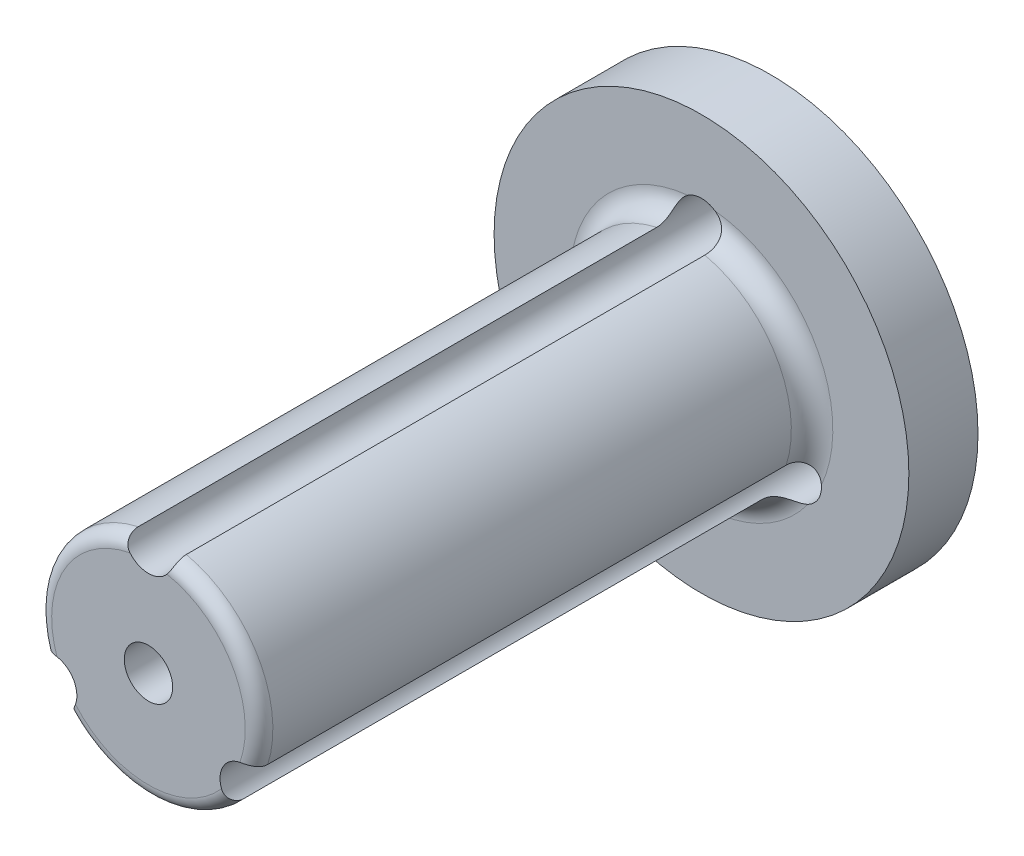
ISO-10303-21;
HEADER;
FILE_DESCRIPTION(('STEP AP214'),'2;1');
FILE_NAME('part.step','',(''),(''),'','','');
FILE_SCHEMA(('AUTOMOTIVE_DESIGN { 1 0 10303 214 1 1 1 1 }'));
ENDSEC;
DATA;
#1=APPLICATION_CONTEXT('core data for automotive mechanical design processes');
#2=APPLICATION_PROTOCOL_DEFINITION('international standard','automotive_design',2000,#1);
#3=PRODUCT_CONTEXT('',#1,'mechanical');
#4=PRODUCT('Part','Part','',(#3));
#5=PRODUCT_RELATED_PRODUCT_CATEGORY('part','',(#4));
#6=PRODUCT_DEFINITION_FORMATION('','',#4);
#7=PRODUCT_DEFINITION_CONTEXT('part definition',#1,'design');
#8=PRODUCT_DEFINITION('design','',#6,#7);
#9=PRODUCT_DEFINITION_SHAPE('','',#8);
#10=(LENGTH_UNIT() NAMED_UNIT(*) SI_UNIT(.MILLI.,.METRE.));
#11=(NAMED_UNIT(*) PLANE_ANGLE_UNIT() SI_UNIT($,.RADIAN.));
#12=(NAMED_UNIT(*) SI_UNIT($,.STERADIAN.) SOLID_ANGLE_UNIT());
#13=UNCERTAINTY_MEASURE_WITH_UNIT(LENGTH_MEASURE(1.E-05),#10,'distance_accuracy_value','');
#14=(GEOMETRIC_REPRESENTATION_CONTEXT(3) GLOBAL_UNCERTAINTY_ASSIGNED_CONTEXT((#13)) GLOBAL_UNIT_ASSIGNED_CONTEXT((#10,
#11,#12)) REPRESENTATION_CONTEXT('',''));
#15=CARTESIAN_POINT('',(0.,0.,0.));
#16=DIRECTION('',(0.,0.,1.));
#17=DIRECTION('',(1.,0.,0.));
#18=AXIS2_PLACEMENT_3D('',#15,#16,#17);
#19=CARTESIAN_POINT('',(0.,0.,45.));
#20=DIRECTION('',(0.,0.,-1.));
#21=DIRECTION('',(-1.,0.,0.));
#22=AXIS2_PLACEMENT_3D('',#19,#20,#21);
#23=CYLINDRICAL_SURFACE('',#22,8.);
#24=DIRECTION('',(0.,0.,-1.));
#25=VECTOR('',#24,1.);
#26=CARTESIAN_POINT('',(1.73950097656223,7.80859375,24.5));
#27=LINE('',#26,#25);
#28=CARTESIAN_POINT('',(1.73950097656223,7.80859375,6.5));
#29=VERTEX_POINT('',#28);
#30=CARTESIAN_POINT('',(1.73950097656223,7.80859375,44.));
#31=VERTEX_POINT('',#30);
#32=EDGE_CURVE('E147',#29,#31,#27,.F.);
#33=ORIENTED_EDGE('',*,*,#32,.T.);
#34=CARTESIAN_POINT('',(0.,0.,44.));
#35=DIRECTION('',(0.,0.,1.));
#36=DIRECTION('',(1.,0.,0.));
#37=AXIS2_PLACEMENT_3D('',#34,#35,#36);
#38=CIRCLE('',#37,8.);
#39=CARTESIAN_POINT('',(7.63219104361355,-2.39784483938914,44.));
#40=VERTEX_POINT('',#39);
#41=EDGE_CURVE('E296',#31,#40,#38,.F.);
#42=ORIENTED_EDGE('',*,*,#41,.T.);
#43=DIRECTION('',(0.,0.,-1.));
#44=VECTOR('',#43,1.);
#45=CARTESIAN_POINT('',(7.63219104361355,-2.39784483938914,24.5));
#46=LINE('',#45,#44);
#47=CARTESIAN_POINT('',(7.63219104361355,-2.39784483938914,6.5));
#48=VERTEX_POINT('',#47);
#49=EDGE_CURVE('E150',#40,#48,#46,.T.);
#50=ORIENTED_EDGE('',*,*,#49,.T.);
#51=CARTESIAN_POINT('',(0.,0.,6.5));
#52=DIRECTION('',(0.,0.,1.));
#53=DIRECTION('',(1.,0.,0.));
#54=AXIS2_PLACEMENT_3D('',#51,#52,#53);
#55=CIRCLE('',#54,8.);
#56=EDGE_CURVE('E135',#48,#29,#55,.T.);
#57=ORIENTED_EDGE('',*,*,#56,.T.);
#58=EDGE_LOOP('',(#33,#42,#50,#57));
#59=FACE_BOUND('',#58,.T.);
#60=ADVANCED_FACE('F39',(#59),#23,.T.);
#61=DIRECTION('',(0.,0.,-1.));
#62=VECTOR('',#61,1.);
#63=CARTESIAN_POINT('',(-7.6321910436137,-2.39784483938868,24.5));
#64=LINE('',#63,#62);
#65=CARTESIAN_POINT('',(-7.6321910436137,-2.39784483938868,6.5));
#66=VERTEX_POINT('',#65);
#67=CARTESIAN_POINT('',(-7.6321910436137,-2.39784483938868,44.));
#68=VERTEX_POINT('',#67);
#69=EDGE_CURVE('E356',#66,#68,#64,.F.);
#70=ORIENTED_EDGE('',*,*,#69,.T.);
#71=CARTESIAN_POINT('',(0.,0.,44.));
#72=DIRECTION('',(0.,0.,1.));
#73=DIRECTION('',(1.,0.,0.));
#74=AXIS2_PLACEMENT_3D('',#71,#72,#73);
#75=CIRCLE('',#74,8.);
#76=CARTESIAN_POINT('',(-1.73950097656223,7.80859375,44.));
#77=VERTEX_POINT('',#76);
#78=EDGE_CURVE('E11',#68,#77,#75,.F.);
#79=ORIENTED_EDGE('',*,*,#78,.T.);
#80=DIRECTION('',(0.,0.,-1.));
#81=VECTOR('',#80,1.);
#82=CARTESIAN_POINT('',(-1.73950097656223,7.80859375,24.5));
#83=LINE('',#82,#81);
#84=CARTESIAN_POINT('',(-1.73950097656223,7.80859375,6.5));
#85=VERTEX_POINT('',#84);
#86=EDGE_CURVE('E162',#77,#85,#83,.T.);
#87=ORIENTED_EDGE('',*,*,#86,.T.);
#88=CARTESIAN_POINT('',(0.,0.,6.5));
#89=DIRECTION('',(0.,0.,1.));
#90=DIRECTION('',(1.,0.,0.));
#91=AXIS2_PLACEMENT_3D('',#88,#89,#90);
#92=CIRCLE('',#91,8.);
#93=EDGE_CURVE('E143',#85,#66,#92,.T.);
#94=ORIENTED_EDGE('',*,*,#93,.T.);
#95=EDGE_LOOP('',(#70,#79,#87,#94));
#96=FACE_BOUND('',#95,.T.);
#97=ADVANCED_FACE('F366',(#96),#23,.T.);
#98=CARTESIAN_POINT('',(0.,0.,5.));
#99=DIRECTION('',(0.,0.,-1.));
#100=DIRECTION('',(-1.,0.,0.));
#101=AXIS2_PLACEMENT_3D('',#98,#99,#100);
#102=CYLINDRICAL_SURFACE('',#101,15.);
#103=CARTESIAN_POINT('',(0.,0.,5.));
#104=DIRECTION('',(0.,0.,1.));
#105=DIRECTION('',(1.,0.,0.));
#106=AXIS2_PLACEMENT_3D('',#103,#104,#105);
#107=CIRCLE('',#106,15.);
#108=CARTESIAN_POINT('',(15.,0.,5.));
#109=VERTEX_POINT('',#108);
#110=EDGE_CURVE('E172',#109,#109,#107,.T.);
#111=ORIENTED_EDGE('',*,*,#110,.F.);
#112=EDGE_LOOP('',(#111));
#113=FACE_BOUND('',#112,.T.);
#114=CARTESIAN_POINT('',(0.,0.,0.));
#115=DIRECTION('',(0.,0.,1.));
#116=DIRECTION('',(1.,0.,0.));
#117=AXIS2_PLACEMENT_3D('',#114,#115,#116);
#118=CIRCLE('',#117,15.);
#119=CARTESIAN_POINT('',(15.,0.,0.));
#120=VERTEX_POINT('',#119);
#121=EDGE_CURVE('E166',#120,#120,#118,.T.);
#122=ORIENTED_EDGE('',*,*,#121,.T.);
#123=EDGE_LOOP('',(#122));
#124=FACE_BOUND('',#123,.T.);
#125=ADVANCED_FACE('F225',(#113,#124),#102,.T.);
#126=CARTESIAN_POINT('',(0.,0.,5.));
#127=DIRECTION('',(0.,0.,1.));
#128=DIRECTION('',(1.,0.,0.));
#129=AXIS2_PLACEMENT_3D('',#126,#127,#128);
#130=PLANE('',#129);
#131=CARTESIAN_POINT('',(0.,8.,5.));
#132=DIRECTION('',(0.,0.,1.));
#133=DIRECTION('',(1.,0.,0.));
#134=AXIS2_PLACEMENT_3D('',#131,#132,#133);
#135=CIRCLE('',#134,1.75);
#136=CARTESIAN_POINT('',(0.980951076582536,9.44921875,5.));
#137=VERTEX_POINT('',#136);
#138=CARTESIAN_POINT('',(-0.980951076582536,9.44921875,5.));
#139=VERTEX_POINT('',#138);
#140=EDGE_CURVE('E161',#137,#139,#135,.T.);
#141=ORIENTED_EDGE('',*,*,#140,.F.);
#142=CARTESIAN_POINT('',(0.,0.,5.));
#143=DIRECTION('',(0.,0.,1.));
#144=DIRECTION('',(1.,0.,0.));
#145=AXIS2_PLACEMENT_3D('',#142,#143,#144);
#146=CIRCLE('',#145,9.5);
#147=CARTESIAN_POINT('',(8.67373902170759,-3.87508082280963,5.));
#148=VERTEX_POINT('',#147);
#149=EDGE_CURVE('E136',#137,#148,#146,.F.);
#150=ORIENTED_EDGE('',*,*,#149,.T.);
#151=CARTESIAN_POINT('',(6.92820323027517,-4.0000000000002,5.));
#152=DIRECTION('',(0.,0.,1.));
#153=DIRECTION('',(1.,0.,0.));
#154=AXIS2_PLACEMENT_3D('',#151,#152,#153);
#155=CIRCLE('',#154,1.75000000000045);
#156=CARTESIAN_POINT('',(7.69278794512437,-5.574137927191,5.));
#157=VERTEX_POINT('',#156);
#158=EDGE_CURVE('E378',#157,#148,#155,.T.);
#159=ORIENTED_EDGE('',*,*,#158,.F.);
#160=CARTESIAN_POINT('',(0.,0.,5.));
#161=DIRECTION('',(0.,0.,1.));
#162=DIRECTION('',(1.,0.,0.));
#163=AXIS2_PLACEMENT_3D('',#160,#161,#162);
#164=CIRCLE('',#163,9.5);
#165=CARTESIAN_POINT('',(-7.69278794512463,-5.57413792719064,5.));
#166=VERTEX_POINT('',#165);
#167=EDGE_CURVE('E194',#157,#166,#164,.F.);
#168=ORIENTED_EDGE('',*,*,#167,.T.);
#169=CARTESIAN_POINT('',(-6.92820323027585,-3.9999999999998,5.));
#170=DIRECTION('',(0.,0.,1.));
#171=DIRECTION('',(1.,0.,0.));
#172=AXIS2_PLACEMENT_3D('',#169,#170,#171);
#173=CIRCLE('',#172,1.7500000000003);
#174=CARTESIAN_POINT('',(-8.67373902170807,-3.87508082280856,5.));
#175=VERTEX_POINT('',#174);
#176=EDGE_CURVE('E189',#175,#166,#173,.T.);
#177=ORIENTED_EDGE('',*,*,#176,.F.);
#178=CARTESIAN_POINT('',(0.,0.,5.));
#179=DIRECTION('',(0.,0.,1.));
#180=DIRECTION('',(1.,0.,0.));
#181=AXIS2_PLACEMENT_3D('',#178,#179,#180);
#182=CIRCLE('',#181,9.5);
#183=EDGE_CURVE('E153',#175,#139,#182,.F.);
#184=ORIENTED_EDGE('',*,*,#183,.T.);
#185=EDGE_LOOP('',(#141,#150,#159,#168,#177,#184));
#186=FACE_BOUND('',#185,.T.);
#187=ORIENTED_EDGE('',*,*,#110,.T.);
#188=EDGE_LOOP('',(#187));
#189=FACE_BOUND('',#188,.T.);
#190=ADVANCED_FACE('F360',(#186,#189),#130,.T.);
#191=CARTESIAN_POINT('',(0.,0.,0.));
#192=DIRECTION('',(0.,0.,1.));
#193=DIRECTION('',(1.,0.,0.));
#194=AXIS2_PLACEMENT_3D('',#191,#192,#193);
#195=PLANE('',#194);
#196=CARTESIAN_POINT('',(0.,8.,0.));
#197=DIRECTION('',(0.,0.,-1.));
#198=DIRECTION('',(-1.,0.,0.));
#199=AXIS2_PLACEMENT_3D('',#196,#197,#198);
#200=CIRCLE('',#199,1.75);
#201=CARTESIAN_POINT('',(-1.75,8.,0.));
#202=VERTEX_POINT('',#201);
#203=EDGE_CURVE('E384',#202,#202,#200,.T.);
#204=ORIENTED_EDGE('',*,*,#203,.F.);
#205=EDGE_LOOP('',(#204));
#206=FACE_BOUND('',#205,.T.);
#207=CARTESIAN_POINT('',(0.,0.,0.));
#208=DIRECTION('',(0.,0.,-1.));
#209=DIRECTION('',(-1.,0.,0.));
#210=AXIS2_PLACEMENT_3D('',#207,#208,#209);
#211=CIRCLE('',#210,1.75);
#212=CARTESIAN_POINT('',(-1.75,0.,0.));
#213=VERTEX_POINT('',#212);
#214=EDGE_CURVE('E401',#213,#213,#211,.T.);
#215=ORIENTED_EDGE('',*,*,#214,.F.);
#216=EDGE_LOOP('',(#215));
#217=FACE_BOUND('',#216,.T.);
#218=CARTESIAN_POINT('',(-6.92820323027585,-3.9999999999998,0.));
#219=DIRECTION('',(0.,0.,-1.));
#220=DIRECTION('',(-1.,0.,0.));
#221=AXIS2_PLACEMENT_3D('',#218,#219,#220);
#222=CIRCLE('',#221,1.7500000000003);
#223=CARTESIAN_POINT('',(-8.67820323027615,-3.9999999999998,0.));
#224=VERTEX_POINT('',#223);
#225=EDGE_CURVE('E397',#224,#224,#222,.T.);
#226=ORIENTED_EDGE('',*,*,#225,.F.);
#227=EDGE_LOOP('',(#226));
#228=FACE_BOUND('',#227,.T.);
#229=CARTESIAN_POINT('',(6.92820323027517,-4.0000000000002,0.));
#230=DIRECTION('',(0.,0.,-1.));
#231=DIRECTION('',(-1.,0.,0.));
#232=AXIS2_PLACEMENT_3D('',#229,#230,#231);
#233=CIRCLE('',#232,1.75000000000045);
#234=CARTESIAN_POINT('',(5.17820323027472,-4.0000000000002,0.));
#235=VERTEX_POINT('',#234);
#236=EDGE_CURVE('E393',#235,#235,#233,.T.);
#237=ORIENTED_EDGE('',*,*,#236,.F.);
#238=EDGE_LOOP('',(#237));
#239=FACE_BOUND('',#238,.T.);
#240=ORIENTED_EDGE('',*,*,#121,.F.);
#241=EDGE_LOOP('',(#240));
#242=FACE_BOUND('',#241,.T.);
#243=ADVANCED_FACE('F409',(#206,#217,#228,#239,#242),#195,.F.);
#244=DIRECTION('',(0.,0.,-1.));
#245=VECTOR('',#244,1.);
#246=CARTESIAN_POINT('',(5.89269006705073,-5.41074891061133,24.5));
#247=LINE('',#246,#245);
#248=CARTESIAN_POINT('',(5.89269006705073,-5.41074891061133,6.5));
#249=VERTEX_POINT('',#248);
#250=CARTESIAN_POINT('',(5.89269006705073,-5.41074891061133,44.));
#251=VERTEX_POINT('',#250);
#252=EDGE_CURVE('E374',#249,#251,#247,.F.);
#253=ORIENTED_EDGE('',*,*,#252,.T.);
#254=CARTESIAN_POINT('',(0.,0.,44.));
#255=DIRECTION('',(0.,0.,1.));
#256=DIRECTION('',(1.,0.,0.));
#257=AXIS2_PLACEMENT_3D('',#254,#255,#256);
#258=CIRCLE('',#257,8.);
#259=CARTESIAN_POINT('',(-5.89269006705132,-5.41074891061069,44.));
#260=VERTEX_POINT('',#259);
#261=EDGE_CURVE('E64',#251,#260,#258,.F.);
#262=ORIENTED_EDGE('',*,*,#261,.T.);
#263=DIRECTION('',(0.,0.,-1.));
#264=VECTOR('',#263,1.);
#265=CARTESIAN_POINT('',(-5.89269006705132,-5.41074891061069,24.5));
#266=LINE('',#265,#264);
#267=CARTESIAN_POINT('',(-5.89269006705132,-5.41074891061069,6.5));
#268=VERTEX_POINT('',#267);
#269=EDGE_CURVE('E372',#260,#268,#266,.T.);
#270=ORIENTED_EDGE('',*,*,#269,.T.);
#271=CARTESIAN_POINT('',(0.,0.,6.5));
#272=DIRECTION('',(0.,0.,1.));
#273=DIRECTION('',(1.,0.,0.));
#274=AXIS2_PLACEMENT_3D('',#271,#272,#273);
#275=CIRCLE('',#274,8.);
#276=EDGE_CURVE('E199',#268,#249,#275,.T.);
#277=ORIENTED_EDGE('',*,*,#276,.T.);
#278=EDGE_LOOP('',(#253,#262,#270,#277));
#279=FACE_BOUND('',#278,.T.);
#280=ADVANCED_FACE('F375',(#279),#23,.T.);
#281=CARTESIAN_POINT('',(0.,0.,45.));
#282=DIRECTION('',(0.,0.,1.));
#283=DIRECTION('',(1.,0.,0.));
#284=AXIS2_PLACEMENT_3D('',#281,#282,#283);
#285=PLANE('',#284);
#286=CARTESIAN_POINT('',(6.92820323027517,-4.0000000000002,45.));
#287=DIRECTION('',(0.,0.,1.));
#288=DIRECTION('',(1.,0.,0.));
#289=AXIS2_PLACEMENT_3D('',#286,#287,#288);
#290=CIRCLE('',#289,1.75000000000045);
#291=CARTESIAN_POINT('',(6.61913553949347,-2.27750844341234,45.));
#292=VERTEX_POINT('',#291);
#293=CARTESIAN_POINT('',(5.28194793907498,-4.59358530658804,45.));
#294=VERTEX_POINT('',#293);
#295=EDGE_CURVE('E176',#292,#294,#290,.T.);
#296=ORIENTED_EDGE('',*,*,#295,.F.);
#297=CARTESIAN_POINT('',(0.,0.,45.));
#298=DIRECTION('',(0.,0.,1.));
#299=DIRECTION('',(1.,0.,0.));
#300=AXIS2_PLACEMENT_3D('',#297,#298,#299);
#301=CIRCLE('',#300,7.);
#302=CARTESIAN_POINT('',(1.33718760041773,6.87109375,45.));
#303=VERTEX_POINT('',#302);
#304=EDGE_CURVE('E316',#292,#303,#301,.T.);
#305=ORIENTED_EDGE('',*,*,#304,.T.);
#306=CARTESIAN_POINT('',(0.,8.,45.));
#307=DIRECTION('',(0.,0.,1.));
#308=DIRECTION('',(1.,0.,0.));
#309=AXIS2_PLACEMENT_3D('',#306,#307,#308);
#310=CIRCLE('',#309,1.75);
#311=CARTESIAN_POINT('',(-1.33718760041773,6.87109375,45.));
#312=VERTEX_POINT('',#311);
#313=EDGE_CURVE('E154',#312,#303,#310,.T.);
#314=ORIENTED_EDGE('',*,*,#313,.F.);
#315=CARTESIAN_POINT('',(0.,0.,45.));
#316=DIRECTION('',(0.,0.,1.));
#317=DIRECTION('',(1.,0.,0.));
#318=AXIS2_PLACEMENT_3D('',#315,#316,#317);
#319=CIRCLE('',#318,7.);
#320=CARTESIAN_POINT('',(-6.61913553949351,-2.27750844341222,45.));
#321=VERTEX_POINT('',#320);
#322=EDGE_CURVE('E326',#312,#321,#319,.T.);
#323=ORIENTED_EDGE('',*,*,#322,.T.);
#324=CARTESIAN_POINT('',(-6.92820323027585,-3.9999999999998,45.));
#325=DIRECTION('',(0.,0.,1.));
#326=DIRECTION('',(1.,0.,0.));
#327=AXIS2_PLACEMENT_3D('',#324,#325,#326);
#328=CIRCLE('',#327,1.7500000000003);
#329=CARTESIAN_POINT('',(-5.28194793907568,-4.59358530658724,45.));
#330=VERTEX_POINT('',#329);
#331=EDGE_CURVE('E183',#330,#321,#328,.T.);
#332=ORIENTED_EDGE('',*,*,#331,.F.);
#333=CARTESIAN_POINT('',(0.,0.,45.));
#334=DIRECTION('',(0.,0.,1.));
#335=DIRECTION('',(1.,0.,0.));
#336=AXIS2_PLACEMENT_3D('',#333,#334,#335);
#337=CIRCLE('',#336,7.);
#338=EDGE_CURVE('E319',#330,#294,#337,.T.);
#339=ORIENTED_EDGE('',*,*,#338,.T.);
#340=EDGE_LOOP('',(#296,#305,#314,#323,#332,#339));
#341=FACE_BOUND('',#340,.T.);
#342=CARTESIAN_POINT('',(0.,0.,45.));
#343=DIRECTION('',(0.,0.,1.));
#344=DIRECTION('',(1.,0.,0.));
#345=AXIS2_PLACEMENT_3D('',#342,#343,#344);
#346=CIRCLE('',#345,1.75);
#347=CARTESIAN_POINT('',(1.75,0.,45.));
#348=VERTEX_POINT('',#347);
#349=EDGE_CURVE('E168',#348,#348,#346,.T.);
#350=ORIENTED_EDGE('',*,*,#349,.F.);
#351=EDGE_LOOP('',(#350));
#352=FACE_BOUND('',#351,.T.);
#353=ADVANCED_FACE('F313',(#341,#352),#285,.T.);
#354=CARTESIAN_POINT('',(6.92820323027517,-4.0000000000002,49.));
#355=DIRECTION('',(0.,0.,-1.));
#356=DIRECTION('',(-1.,0.,0.));
#357=AXIS2_PLACEMENT_3D('',#354,#355,#356);
#358=CYLINDRICAL_SURFACE('',#357,1.75000000000045);
#359=ORIENTED_EDGE('',*,*,#49,.F.);
#360=CARTESIAN_POINT('',(7.63219104361355,-2.39784483938914,44.));
#361=CARTESIAN_POINT('',(7.63218978688258,-2.39784860910094,44.02811120597));
#362=CARTESIAN_POINT('',(7.63109873859668,-2.39736440838002,44.0562087207067));
#363=CARTESIAN_POINT('',(7.62673902320567,-2.39545765616746,44.1121993899972));
#364=CARTESIAN_POINT('',(7.6234705774965,-2.39403520007696,44.1400925650366));
#365=CARTESIAN_POINT('',(7.61041750358698,-2.38842343876988,44.2231086173015));
#366=CARTESIAN_POINT('',(7.59738510645363,-2.38288947693107,44.2776708800824));
#367=CARTESIAN_POINT('',(7.56282698607486,-2.36902018084552,44.3836470441095));
#368=CARTESIAN_POINT('',(7.54129847169464,-2.36068392612621,44.4350599042989));
#369=CARTESIAN_POINT('',(7.49002906625985,-2.34241442823895,44.533332707532));
#370=CARTESIAN_POINT('',(7.46028669202147,-2.33248089678481,44.5801918262348));
#371=CARTESIAN_POINT('',(7.39315258989592,-2.31253392010939,44.6678660326608));
#372=CARTESIAN_POINT('',(7.35578091207197,-2.302520749152,44.7086964888744));
#373=CARTESIAN_POINT('',(7.27416473557805,-2.28402980191697,44.7831624008763));
#374=CARTESIAN_POINT('',(7.229927398189,-2.27555044551536,44.8168052678108));
#375=CARTESIAN_POINT('',(7.13832102513075,-2.26207690210707,44.8743338061451));
#376=CARTESIAN_POINT('',(7.09123968926836,-2.25692266301807,44.8986400858434));
#377=CARTESIAN_POINT('',(6.99349194759196,-2.25053276153458,44.9394086169296));
#378=CARTESIAN_POINT('',(6.9428228141078,-2.24930011400131,44.955864825042));
#379=CARTESIAN_POINT('',(6.84650964319938,-2.25133586739713,44.9792827583578));
#380=CARTESIAN_POINT('',(6.80108004075557,-2.25403417317542,44.9872078524021));
#381=CARTESIAN_POINT('',(6.71001736273103,-2.26304154711235,44.9975828022077));
#382=CARTESIAN_POINT('',(6.66438470731343,-2.26934505806379,45.0000410563316));
#383=CARTESIAN_POINT('',(6.61913553949347,-2.27750844341234,45.));
#384=B_SPLINE_CURVE_WITH_KNOTS('',3,(#360,#361,#362,#363,#364,#365,#366,#367,#368,#369,#370,
#371,#372,#373,#374,#375,#376,#377,#378,#379,#380,#381,#382,#383),.UNSPECIFIED.,.F.,.F.,(4,2,2,
2,2,2,2,2,2,2,2,4),(0.,0.0842812335076775,0.168553898677798,0.33679461114836,0.50509063993801,
0.673417077979861,0.841306715286471,1.00902239652084,1.16790377859235,1.32690727682666,
1.4650199907131,1.60292038372158),.UNSPECIFIED.);
#385=EDGE_CURVE('E295',#40,#292,#384,.T.);
#386=ORIENTED_EDGE('',*,*,#385,.T.);
#387=ORIENTED_EDGE('',*,*,#295,.T.);
#388=CARTESIAN_POINT('',(5.28194793907498,-4.59358530658804,45.));
#389=CARTESIAN_POINT('',(5.29089511913655,-4.61840465135959,45.0000004961663));
#390=CARTESIAN_POINT('',(5.30040576957352,-4.64301510322305,44.9992027444303));
#391=CARTESIAN_POINT('',(5.3204876571239,-4.69169662891554,44.9958896995651));
#392=CARTESIAN_POINT('',(5.33105950027535,-4.71576738481951,44.9933734201845));
#393=CARTESIAN_POINT('',(5.36423157481409,-4.78690392049663,44.9830722290595));
#394=CARTESIAN_POINT('',(5.38830408770301,-4.83293739573089,44.9725353802326));
#395=CARTESIAN_POINT('',(5.43928898421718,-4.92099804442384,44.9435871570175));
#396=CARTESIAN_POINT('',(5.46621147492046,-4.96300988008116,44.9251469987402));
#397=CARTESIAN_POINT('',(5.52123151874431,-5.04174662024218,44.8805194929087));
#398=CARTESIAN_POINT('',(5.54932771993859,-5.07847740217209,44.8543408584813));
#399=CARTESIAN_POINT('',(5.60378308384687,-5.14462755483881,44.7961397873217));
#400=CARTESIAN_POINT('',(5.63016503528472,-5.17429311919149,44.7644164893853));
#401=CARTESIAN_POINT('',(5.68098486326521,-5.22813670058207,44.695241699529));
#402=CARTESIAN_POINT('',(5.70542137703587,-5.25231089252479,44.6577862450033));
#403=CARTESIAN_POINT('',(5.75208847505147,-5.29627646387308,44.5762141234298));
#404=CARTESIAN_POINT('',(5.77416078488218,-5.31580754088716,44.5318666902773));
#405=CARTESIAN_POINT('',(5.81342297204321,-5.34923346065272,44.4390884568644));
#406=CARTESIAN_POINT('',(5.83061210916474,-5.36312744905064,44.3906570389804));
#407=CARTESIAN_POINT('',(5.86038863604105,-5.38660379711883,44.2863215222657));
#408=CARTESIAN_POINT('',(5.87241510959286,-5.39567890709282,44.2301384377709));
#409=CARTESIAN_POINT('',(5.88453248139883,-5.40473255195166,44.1445660892495));
#410=CARTESIAN_POINT('',(5.88758464266177,-5.40699055665717,44.1157895564909));
#411=CARTESIAN_POINT('',(5.8916648330923,-5.40999699454454,44.0580139877802));
#412=CARTESIAN_POINT('',(5.89269279143663,-5.41074537490737,44.0290149440783));
#413=CARTESIAN_POINT('',(5.89269006705073,-5.41074891061133,44.));
#414=B_SPLINE_CURVE_WITH_KNOTS('',3,(#388,#389,#390,#391,#392,#393,#394,#395,#396,#397,#398,
#399,#400,#401,#402,#403,#404,#405,#406,#407,#408,#409,#410,#411,#412,#413),.UNSPECIFIED.,.F.,
.F.,(4,2,2,2,2,2,2,2,2,2,2,2,4),(0.,0.0791144673625341,0.158274376187263,0.316457259470695,
0.475221207490775,0.633807071969064,0.785584501620673,0.937467332048787,1.09650939957048,
1.25557556241005,1.4291129174139,1.51609543639021,1.6030809986757),.UNSPECIFIED.);
#415=EDGE_CURVE('E288',#294,#251,#414,.T.);
#416=ORIENTED_EDGE('',*,*,#415,.T.);
#417=ORIENTED_EDGE('',*,*,#252,.F.);
#418=CARTESIAN_POINT('',(5.89269006705073,-5.41074891061133,6.5));
#419=CARTESIAN_POINT('',(5.89269406280909,-5.41073872165121,6.45871284850004));
#420=CARTESIAN_POINT('',(5.89407273416536,-5.41176346569479,6.41742706896812));
#421=CARTESIAN_POINT('',(5.89960727120262,-5.41580785517767,6.33513844263905));
#422=CARTESIAN_POINT('',(5.90376326635917,-5.41882759362118,6.29413560912255));
#423=CARTESIAN_POINT('',(5.91488914100291,-5.42679332486031,6.21263219274662));
#424=CARTESIAN_POINT('',(5.92186348609199,-5.43174237415716,6.17213251258417));
#425=CARTESIAN_POINT('',(5.93867060940302,-5.44340866584259,6.09200298710328));
#426=CARTESIAN_POINT('',(5.94850330868447,-5.45012585939902,6.05237311779537));
#427=CARTESIAN_POINT('',(5.98241772182104,-5.47266470959441,5.93511089383794));
#428=CARTESIAN_POINT('',(6.0109115012075,-5.49087023915009,5.85913827244902));
#429=CARTESIAN_POINT('',(6.08008806622173,-5.53127114237435,5.71422798138761));
#430=CARTESIAN_POINT('',(6.12075749995087,-5.55346213494831,5.64528271592281));
#431=CARTESIAN_POINT('',(6.2127395375977,-5.59784728223869,5.51888848300046));
#432=CARTESIAN_POINT('',(6.26361847307154,-5.62001282186054,5.46111605986805));
#433=CARTESIAN_POINT('',(6.37603311935911,-5.66167997584347,5.35591180621979));
#434=CARTESIAN_POINT('',(6.43756141752733,-5.68118342641228,5.30847283448616));
#435=CARTESIAN_POINT('',(6.56322830600965,-5.7126283778671,5.2286863896568));
#436=CARTESIAN_POINT('',(6.62661390165095,-5.72509822784466,5.19535566743866));
#437=CARTESIAN_POINT('',(6.758299900172,-5.74299846549415,5.13782746340369));
#438=CARTESIAN_POINT('',(6.82659938098415,-5.74843017022356,5.11362827339199));
#439=CARTESIAN_POINT('',(6.9646909707572,-5.75096416303512,5.07370387637624));
#440=CARTESIAN_POINT('',(7.03444854960472,-5.74818258972398,5.05786421291157));
#441=CARTESIAN_POINT('',(7.17433162425723,-5.73403405883886,5.03273498147848));
#442=CARTESIAN_POINT('',(7.24445748014904,-5.72265595943836,5.02345394428318));
#443=CARTESIAN_POINT('',(7.37915933021638,-5.6922240836797,5.0102945297637));
#444=CARTESIAN_POINT('',(7.44382050199776,-5.67365657245154,5.00613267448008));
#445=CARTESIAN_POINT('',(7.57049625773741,-5.62925783378371,5.00100126157638));
#446=CARTESIAN_POINT('',(7.63251896700503,-5.60345109777534,5.0000210780495));
#447=CARTESIAN_POINT('',(7.69278794512437,-5.574137927191,5.));
#448=B_SPLINE_CURVE_WITH_KNOTS('',3,(#418,#419,#420,#421,#422,#423,#424,#425,#426,#427,#428,
#429,#430,#431,#432,#433,#434,#435,#436,#437,#438,#439,#440,#441,#442,#443,#444,#445,#446,#447),
.UNSPECIFIED.,.F.,.F.,(4,2,2,2,2,2,2,2,2,2,2,2,2,2,4),(0.,0.123823108477727,0.247651989844821,
0.371677849001791,0.495700283203983,0.743842322911542,0.991713239076821,1.23070088009871,
1.46952283438764,1.6865094138047,1.90345538236726,2.11734841699476,2.33151915170971,
2.53320134750509,2.73420928357523),.UNSPECIFIED.);
#449=EDGE_CURVE('E236',#249,#157,#448,.T.);
#450=ORIENTED_EDGE('',*,*,#449,.T.);
#451=ORIENTED_EDGE('',*,*,#158,.T.);
#452=CARTESIAN_POINT('',(8.67373902170759,-3.87508082280963,5.));
#453=CARTESIAN_POINT('',(8.67066745475763,-3.83216462649147,5.00000460118286));
#454=CARTESIAN_POINT('',(8.6660131993461,-3.78937602657043,5.00041264318316));
#455=CARTESIAN_POINT('',(8.65356989692251,-3.70425691861459,5.00235319080033));
#456=CARTESIAN_POINT('',(8.64577888965105,-3.66192671406471,5.00388640006511));
#457=CARTESIAN_POINT('',(8.61765744703327,-3.53556866092694,5.01067393459036));
#458=CARTESIAN_POINT('',(8.59261137111808,-3.45262879479402,5.01812286684352));
#459=CARTESIAN_POINT('',(8.53089188078188,-3.29195145857721,5.04169499201923));
#460=CARTESIAN_POINT('',(8.49415849927965,-3.21424338086956,5.05786322745449));
#461=CARTESIAN_POINT('',(8.41152473088846,-3.06764385790046,5.10154947745827));
#462=CARTESIAN_POINT('',(8.36566073601073,-2.9987191385238,5.12902288245918));
#463=CARTESIAN_POINT('',(8.27425771241209,-2.87945537370145,5.1930589335426));
#464=CARTESIAN_POINT('',(8.22931117717743,-2.82788468684597,5.22817805815457));
#465=CARTESIAN_POINT('',(8.13860093499069,-2.73442391230208,5.30882180884733));
#466=CARTESIAN_POINT('',(8.09283677639628,-2.69253936512923,5.35435236084648));
#467=CARTESIAN_POINT('',(8.00749756958114,-2.62142164077417,5.45101134481344));
#468=CARTESIAN_POINT('',(7.96771803626752,-2.59145754599534,5.5014283386316));
#469=CARTESIAN_POINT('',(7.89282077426588,-2.53914294784747,5.60917456449888));
#470=CARTESIAN_POINT('',(7.85770347494267,-2.51679314541433,5.66650443225726));
#471=CARTESIAN_POINT('',(7.79206069986681,-2.47756655187818,5.79024138332588));
#472=CARTESIAN_POINT('',(7.76193091115128,-2.46109281253527,5.8569851201802));
#473=CARTESIAN_POINT('',(7.71046389696005,-2.43430066443614,5.99495233991614));
#474=CARTESIAN_POINT('',(7.68912896213687,-2.42398385896348,6.06617698430634));
#475=CARTESIAN_POINT('',(7.65929755020242,-2.40996349946639,6.19781909587382));
#476=CARTESIAN_POINT('',(7.64914863467918,-2.40538533468684,6.25777428605908));
#477=CARTESIAN_POINT('',(7.63898398494283,-2.40084305506794,6.34831699992603));
#478=CARTESIAN_POINT('',(7.63643890101087,-2.39971643772364,6.37858234194651));
#479=CARTESIAN_POINT('',(7.63304182799066,-2.39821842996114,6.43922963190219));
#480=CARTESIAN_POINT('',(7.63219001094544,-2.39784711628487,6.46961159137202));
#481=CARTESIAN_POINT('',(7.63219104361355,-2.39784483938914,6.5));
#482=B_SPLINE_CURVE_WITH_KNOTS('',3,(#452,#453,#454,#455,#456,#457,#458,#459,#460,#461,#462,
#463,#464,#465,#466,#467,#468,#469,#470,#471,#472,#473,#474,#475,#476,#477,#478,#479,#480,#481),
.UNSPECIFIED.,.F.,.F.,(4,2,2,2,2,2,2,2,2,2,2,2,2,2,4),(0.,0.129014407687284,0.258109566178222,
0.517654340188707,0.778552906671908,1.03843170646094,1.26783778274699,1.49737475755277,
1.70904771234159,1.92074014748386,2.14498358125942,2.36928538322904,2.55174832229299,
2.64287719859624,2.7340153335023),.UNSPECIFIED.);
#483=EDGE_CURVE('E142',#148,#48,#482,.T.);
#484=ORIENTED_EDGE('',*,*,#483,.T.);
#485=EDGE_LOOP('',(#359,#386,#387,#416,#417,#450,#451,#484));
#486=FACE_BOUND('',#485,.T.);
#487=ORIENTED_EDGE('',*,*,#236,.T.);
#488=EDGE_LOOP('',(#487));
#489=FACE_BOUND('',#488,.T.);
#490=ADVANCED_FACE('F261',(#486,#489),#358,.F.);
#491=CARTESIAN_POINT('',(-6.92820323027585,-3.9999999999998,49.));
#492=DIRECTION('',(0.,0.,-1.));
#493=DIRECTION('',(-1.,0.,0.));
#494=AXIS2_PLACEMENT_3D('',#491,#492,#493);
#495=CYLINDRICAL_SURFACE('',#494,1.7500000000003);
#496=ORIENTED_EDGE('',*,*,#269,.F.);
#497=CARTESIAN_POINT('',(-5.89269006705132,-5.41074891061069,44.));
#498=CARTESIAN_POINT('',(-5.89269270335201,-5.41074593739384,44.02811120597));
#499=CARTESIAN_POINT('',(-5.89172784908422,-5.41004316222195,44.0562087207067));
#500=CARTESIAN_POINT('',(-5.88789669553391,-5.40722091404635,44.1121993899972));
#501=CARTESIAN_POINT('',(-5.8850305895692,-5.40510158507657,44.1400925650366));
#502=CARTESIAN_POINT('',(-5.87364412476253,-5.39660317212699,44.2231086173015));
#503=CARTESIAN_POINT('',(-5.86233537465987,-5.3880837660567,44.2776708800824));
#504=CARTESIAN_POINT('',(-5.8330451517278,-5.36509020394442,44.3836470441095));
#505=CARTESIAN_POINT('',(-5.81506148617836,-5.35061409094506,44.4350599042989));
#506=CARTESIAN_POINT('',(-5.77360493417621,-5.31534823234522,44.533332707532));
#507=CARTESIAN_POINT('',(-5.75013105646845,-5.29455734641299,44.5801918262348));
#508=CARTESIAN_POINT('',(-5.69928941687607,-5.2463909968497,44.6678660326609));
#509=CARTESIAN_POINT('',(-5.67193191754257,-5.2190327599508,44.7086964888744));
#510=CARTESIAN_POINT('',(-5.61511019925005,-5.15759655136482,44.7831624008763));
#511=CARTESIAN_POINT('',(-5.585648192504,-5.12352557159092,44.8168052678108));
#512=CARTESIAN_POINT('',(-5.52817657510432,-5.05092889707806,44.8743338061451));
#513=CARTESIAN_POINT('',(-5.50017220518488,-5.01273238372161,44.8986400858434));
#514=CARTESIAN_POINT('',(-5.44576451733432,-4.93127530700902,44.9394086169296));
#515=CARTESIAN_POINT('',(-5.41936244651453,-4.88801087399063,44.955864825042));
#516=CARTESIAN_POINT('',(-5.37296887521695,-4.80358334456698,44.9792827583578));
#517=CARTESIAN_POINT('',(-5.35259087534623,-4.76289100187765,44.9872078524021));
#518=CARTESIAN_POINT('',(-5.31486015098474,-4.67952472240325,44.9975828022077));
#519=CARTESIAN_POINT('',(-5.29750282389292,-4.63685392809373,45.0000410563316));
#520=CARTESIAN_POINT('',(-5.28194793907568,-4.59358530658724,45.));
#521=B_SPLINE_CURVE_WITH_KNOTS('',3,(#497,#498,#499,#500,#501,#502,#503,#504,#505,#506,#507,
#508,#509,#510,#511,#512,#513,#514,#515,#516,#517,#518,#519,#520),.UNSPECIFIED.,.F.,.F.,(4,2,2,
2,2,2,2,2,2,2,2,4),(0.,0.0842812335076776,0.168553898677798,0.336794611148359,0.505090639938015,
0.67341707797987,0.841306715286474,1.00902239652084,1.16790377859234,1.32690727682664,
1.46501999071312,1.60292038372165),.UNSPECIFIED.);
#522=EDGE_CURVE('E49',#260,#330,#521,.T.);
#523=ORIENTED_EDGE('',*,*,#522,.T.);
#524=ORIENTED_EDGE('',*,*,#331,.T.);
#525=CARTESIAN_POINT('',(-6.61913553949351,-2.27750844341222,45.));
#526=CARTESIAN_POINT('',(-6.64510331260174,-2.27284725625198,45.0000004961663));
#527=CARTESIAN_POINT('',(-6.6711719143326,-2.26877849520518,44.9992027444303));
#528=CARTESIAN_POINT('',(-6.72337229605247,-2.26182915713349,44.9958896995652));
#529=CARTESIAN_POINT('',(-6.74950410372934,-2.25894926391547,44.9933734201845));
#530=CARTESIAN_POINT('',(-6.82769618803232,-2.25210885532367,44.9830722290595));
#531=CARTESIAN_POINT('',(-6.87959860345413,-2.24993952540126,44.9725353802326));
#532=CARTESIAN_POINT('',(-6.98135381055306,-2.25006341664534,44.9435871570175));
#533=CARTESIAN_POINT('',(-7.03119837284356,-2.25237305969886,44.9251469987402));
#534=CARTESIAN_POINT('',(-7.12689641194611,-2.26065344528712,44.8805194929087));
#535=CARTESIAN_POINT('',(-7.17275430279543,-2.26662007830624,44.8543408584813));
#536=CARTESIAN_POINT('',(-7.25726969742318,-2.28070473048976,44.7961397873217));
#537=CARTESIAN_POINT('',(-7.29615180548914,-2.28871938846,44.7644164893853));
#538=CARTESIAN_POINT('',(-7.36819162879436,-2.30580885981175,44.695241699529));
#539=CARTESIAN_POINT('',(-7.40134535001806,-2.31488440554571,44.6577862450033));
#540=CARTESIAN_POINT('',(-7.46275420070537,-2.33331651227395,44.5762141234298));
#541=CARTESIAN_POINT('',(-7.49070476447819,-2.3426661548005,44.5318666902773));
#542=CARTESIAN_POINT('',(-7.53928355372054,-2.3599552464073,44.4390884568644));
#543=CARTESIAN_POINT('',(-7.55991066919379,-2.36789448162471,44.3906570389804));
#544=CARTESIAN_POINT('',(-7.59513004644709,-2.38194353630196,44.2863215222657));
#545=CARTESIAN_POINT('',(-7.60900255900261,-2.38782121292878,44.2301384377709));
#546=CARTESIAN_POINT('',(-7.62290193135019,-2.39378834231042,44.1445660892495));
#547=CARTESIAN_POINT('',(-7.6263835014185,-2.39530258914783,44.1157895564909));
#548=CARTESIAN_POINT('',(-7.63102724821913,-2.39733291876926,44.0580139877802));
#549=CARTESIAN_POINT('',(-7.6321893437972,-2.39784896662806,44.0290149440783));
#550=CARTESIAN_POINT('',(-7.63219104361369,-2.39784483938868,44.));
#551=B_SPLINE_CURVE_WITH_KNOTS('',3,(#525,#526,#527,#528,#529,#530,#531,#532,#533,#534,#535,
#536,#537,#538,#539,#540,#541,#542,#543,#544,#545,#546,#547,#548,#549,#550),.UNSPECIFIED.,.F.,
.F.,(4,2,2,2,2,2,2,2,2,2,2,2,4),(0.,0.0791144673625411,0.158274376187278,0.316457259470729,
0.475221207490825,0.633807071969128,0.785584501620742,0.937467332048861,1.09650939957054,
1.2555755624101,1.42911291741396,1.51609543639027,1.60308099867577),.UNSPECIFIED.);
#552=EDGE_CURVE('E56',#321,#68,#551,.T.);
#553=ORIENTED_EDGE('',*,*,#552,.T.);
#554=ORIENTED_EDGE('',*,*,#69,.F.);
#555=CARTESIAN_POINT('',(-7.63219104361369,-2.39784483938868,6.5));
#556=CARTESIAN_POINT('',(-7.63218421759457,-2.39785339429699,6.45871284850004));
#557=CARTESIAN_POINT('',(-7.63376100764682,-2.3985349866932,6.41742706896812));
#558=CARTESIAN_POINT('',(-7.64003082020043,-2.40130584162421,6.33513844263905));
#559=CARTESIAN_POINT('',(-7.64472398798357,-2.40339516978604,6.29413560912254));
#560=CARTESIAN_POINT('',(-7.65718545091825,-2.40904759424726,6.21263219274661));
#561=CARTESIAN_POINT('',(-7.66495862587844,-2.41261302962074,6.17213251258415));
#562=CARTESIAN_POINT('',(-7.68346549250149,-2.42133527952991,6.09200298710326));
#563=CARTESIAN_POINT('',(-7.69419910240423,-2.42649205011721,6.05237311779536));
#564=CARTESIAN_POINT('',(-7.73067552581382,-2.44459336835022,5.93511089383792));
#565=CARTESIAN_POINT('',(-7.76068886659162,-2.46016694037088,5.859138272449));
#566=CARTESIAN_POINT('',(-7.83026535762679,-2.4998751514076,5.71422798138758));
#567=CARTESIAN_POINT('',(-7.86981803779561,-2.52400041788758,5.64528271592278));
#568=CARTESIAN_POINT('',(-7.95424772172322,-2.58146662553638,5.51888848300043));
#569=CARTESIAN_POINT('',(-7.99888310986127,-2.61444630636331,5.46111605986801));
#570=CARTESIAN_POINT('',(-8.09117524685768,-2.69096666881431,5.35591180621974));
#571=CARTESIAN_POINT('',(-8.13882987959584,-2.73450001279519,5.30847283448612));
#572=CARTESIAN_POINT('',(-8.22889545061767,-2.82760825490801,5.22868638965675));
#573=CARTESIAN_POINT('',(-8.27138745530027,-2.8762668659786,5.19535566743862));
#574=CARTESIAN_POINT('',(-8.35273251509905,-2.98136016719579,5.13782746340365));
#575=CARTESIAN_POINT('',(-8.39158624978666,-3.03779340027968,5.11362827339195));
#576=CARTESIAN_POINT('',(-8.46282654682101,-3.15611722866633,5.07370387637621));
#577=CARTESIAN_POINT('',(-8.49529642309484,-3.21791985071034,5.05786421291154));
#578=CARTESIAN_POINT('',(-8.55298497324837,-3.34613641236143,5.03273498147845));
#579=CARTESIAN_POINT('',(-8.57819417806667,-3.41255623472611,5.02345394428316));
#580=CARTESIAN_POINT('',(-8.61919032560852,-3.54442739670046,5.01029452976369));
#581=CARTESIAN_POINT('',(-8.63544097509057,-3.60970936971563,5.00613267448008));
#582=CARTESIAN_POINT('',(-8.66032841737807,-3.74161316156355,5.00100126157638));
#583=CARTESIAN_POINT('',(-8.66899048303989,-3.80822977140498,5.0000210780495));
#584=CARTESIAN_POINT('',(-8.67373902170807,-3.87508082280856,5.));
#585=B_SPLINE_CURVE_WITH_KNOTS('',3,(#555,#556,#557,#558,#559,#560,#561,#562,#563,#564,#565,
#566,#567,#568,#569,#570,#571,#572,#573,#574,#575,#576,#577,#578,#579,#580,#581,#582,#583,#584),
.UNSPECIFIED.,.F.,.F.,(4,2,2,2,2,2,2,2,2,2,2,2,2,2,4),(0.,0.123823108477731,0.247651989844831,
0.371677849001805,0.495700283204001,0.743842322911569,0.991713239076857,1.23070088009875,
1.4695228343877,1.68650941380476,1.90345538236731,2.1173484169948,2.33151915170973,
2.53320134750495,2.73420928357491),.UNSPECIFIED.);
#586=EDGE_CURVE('E251',#66,#175,#585,.T.);
#587=ORIENTED_EDGE('',*,*,#586,.T.);
#588=ORIENTED_EDGE('',*,*,#176,.T.);
#589=CARTESIAN_POINT('',(-7.69278794512463,-5.57413792719065,5.));
#590=CARTESIAN_POINT('',(-7.65408564540432,-5.59293597034161,5.00000460118286));
#591=CARTESIAN_POINT('',(-7.61470250317456,-5.61029956688003,5.00041264318316));
#592=CARTESIAN_POINT('',(-7.53476554212555,-5.64208290485211,5.00235319080033));
#593=CARTESIAN_POINT('',(-7.49421100600224,-5.6565007969089,5.00388640006511));
#594=CARTESIAN_POINT('',(-7.37072100070331,-5.69532593977967,5.01067393459036));
#595=CARTESIAN_POINT('',(-7.28636993168814,-5.71510533483843,5.01812286684352));
#596=CARTESIAN_POINT('',(-7.11635953154389,-5.74199335640701,5.04169499201925));
#597=CARTESIAN_POINT('',(-7.03069567141872,-5.74903535371297,5.0578632274545));
#598=CARTESIAN_POINT('',(-6.86241987614924,-5.75077217256027,5.10154947745829));
#599=CARTESIAN_POINT('',(-6.77979732078149,-5.74551514756543,5.12902288245921));
#600=CARTESIAN_POINT('',(-6.63081035889508,-5.72598968955744,5.19305893354262));
#601=CARTESIAN_POINT('',(-6.56367556637031,-5.71285019165986,5.22817805815459));
#602=CARTESIAN_POINT('',(-6.4373810402646,-5.68102320481463,5.30882180884735));
#603=CARTESIAN_POINT('',(-6.37822587908971,-5.66233255447547,5.35435236084649));
#604=CARTESIAN_POINT('',(-6.27396651973135,-5.62398549561225,5.45101134481345));
#605=CARTESIAN_POINT('',(-6.22812708579467,-5.60451745660138,5.50142833863161));
#606=CARTESIAN_POINT('',(-6.14537268380904,-5.56581182410798,5.60917456449889));
#607=CARTESIAN_POINT('',(-6.10845853747078,-5.54657425199835,5.66650443225727));
#608=CARTESIAN_POINT('',(-6.04166592342663,-5.5093392379758,5.79024138332589));
#609=CARTESIAN_POINT('',(-6.01233435230258,-5.49148294520895,5.85698512018021));
#610=CARTESIAN_POINT('',(-5.96339816433117,-5.46030727751197,5.99495233991615));
#611=CARTESIAN_POINT('',(-5.94379608129436,-5.44698908470333,6.06617698430636));
#612=CARTESIAN_POINT('',(-5.91673838783248,-5.42816450388588,6.19781909587384));
#613=CARTESIAN_POINT('',(-5.90769912306906,-5.42166436761166,6.25777428605909));
#614=CARTESIAN_POINT('',(-5.89868306865983,-5.41513266252886,6.34831699992604));
#615=CARTESIAN_POINT('',(-5.89643484745334,-5.41349186386117,6.37858234194652));
#616=CARTESIAN_POINT('',(-5.89343899816584,-5.41129891620841,6.4392296319022));
#617=CARTESIAN_POINT('',(-5.89269152256681,-5.41074687784601,6.46961159137202));
#618=CARTESIAN_POINT('',(-5.89269006705132,-5.41074891061068,6.5));
#619=B_SPLINE_CURVE_WITH_KNOTS('',3,(#589,#590,#591,#592,#593,#594,#595,#596,#597,#598,#599,
#600,#601,#602,#603,#604,#605,#606,#607,#608,#609,#610,#611,#612,#613,#614,#615,#616,#617,#618),
.UNSPECIFIED.,.F.,.F.,(4,2,2,2,2,2,2,2,2,2,2,2,2,2,4),(0.,0.129014407687258,0.258109566178168,
0.5176543401886,0.778552906671744,1.03843170646072,1.26783778274674,1.49737475755248,
1.70904771234128,1.92074014748355,2.14498358125911,2.36928538322874,2.55174832229268,
2.64287719859592,2.73401533350198),.UNSPECIFIED.);
#620=EDGE_CURVE('E242',#166,#268,#619,.T.);
#621=ORIENTED_EDGE('',*,*,#620,.T.);
#622=EDGE_LOOP('',(#496,#523,#524,#553,#554,#587,#588,#621));
#623=FACE_BOUND('',#622,.T.);
#624=ORIENTED_EDGE('',*,*,#225,.T.);
#625=EDGE_LOOP('',(#624));
#626=FACE_BOUND('',#625,.T.);
#627=ADVANCED_FACE('F257',(#623,#626),#495,.F.);
#628=CARTESIAN_POINT('',(0.,0.,49.));
#629=DIRECTION('',(0.,0.,-1.));
#630=DIRECTION('',(-1.,0.,0.));
#631=AXIS2_PLACEMENT_3D('',#628,#629,#630);
#632=CYLINDRICAL_SURFACE('',#631,1.75);
#633=ORIENTED_EDGE('',*,*,#349,.T.);
#634=EDGE_LOOP('',(#633));
#635=FACE_BOUND('',#634,.T.);
#636=ORIENTED_EDGE('',*,*,#214,.T.);
#637=EDGE_LOOP('',(#636));
#638=FACE_BOUND('',#637,.T.);
#639=ADVANCED_FACE('F260',(#635,#638),#632,.F.);
#640=CARTESIAN_POINT('',(0.,8.,49.));
#641=DIRECTION('',(0.,0.,-1.));
#642=DIRECTION('',(-1.,0.,0.));
#643=AXIS2_PLACEMENT_3D('',#640,#641,#642);
#644=CYLINDRICAL_SURFACE('',#643,1.75);
#645=ORIENTED_EDGE('',*,*,#313,.T.);
#646=CARTESIAN_POINT('',(1.33718760041773,6.87109375,45.));
#647=CARTESIAN_POINT('',(1.3542081934644,6.89125190761132,45.0000004961663));
#648=CARTESIAN_POINT('',(1.37076614475829,6.91179359842798,44.9992027444303));
#649=CARTESIAN_POINT('',(1.40288463892779,6.95352578604879,44.9958896995652));
#650=CARTESIAN_POINT('',(1.41844460345321,6.97471664873476,44.9933734201845));
#651=CARTESIAN_POINT('',(1.46346461321746,7.03901277582009,44.9830722290595));
#652=CARTESIAN_POINT('',(1.49129451575036,7.08287692113195,44.9725353802326));
#653=CARTESIAN_POINT('',(1.54206482633513,7.17106146106901,44.9435871570175));
#654=CARTESIAN_POINT('',(1.56498689792235,7.21538293977986,44.9251469987402));
#655=CARTESIAN_POINT('',(1.60566489320106,7.30240006552916,44.8805194929088));
#656=CARTESIAN_POINT('',(1.62342658285609,7.3450974804782,44.8543408584813));
#657=CARTESIAN_POINT('',(1.65348661357556,7.42533228532846,44.7961397873217));
#658=CARTESIAN_POINT('',(1.66598677020366,7.46301250765139,44.7644164893853));
#659=CARTESIAN_POINT('',(1.6872067655284,7.53394556039374,44.695241699529));
#660=CARTESIAN_POINT('',(1.69592397298143,7.56719529807042,44.6577862450033));
#661=CARTESIAN_POINT('',(1.71066572565315,7.62959297614696,44.5762141234298));
#662=CARTESIAN_POINT('',(1.71654397959527,7.65847369568759,44.5318666902773));
#663=CARTESIAN_POINT('',(1.72586058167658,7.70918870705997,44.4390884568645));
#664=CARTESIAN_POINT('',(1.72929856002831,7.73102193067531,44.3906570389805));
#665=CARTESIAN_POINT('',(1.7347414104053,7.76854733342076,44.2863215222657));
#666=CARTESIAN_POINT('',(1.73658744940901,7.78350012002158,44.2301384377709));
#667=CARTESIAN_POINT('',(1.73836944995062,7.79852089426207,44.1445660892495));
#668=CARTESIAN_POINT('',(1.73879885875598,7.80229314580498,44.1157895564909));
#669=CARTESIAN_POINT('',(1.73936241512608,7.80732991331379,44.0580139877802));
#670=CARTESIAN_POINT('',(1.73949655235982,7.80859434153542,44.0290149440784));
#671=CARTESIAN_POINT('',(1.73950097656223,7.80859375,44.));
#672=B_SPLINE_CURVE_WITH_KNOTS('',3,(#646,#647,#648,#649,#650,#651,#652,#653,#654,#655,#656,
#657,#658,#659,#660,#661,#662,#663,#664,#665,#666,#667,#668,#669,#670,#671),.UNSPECIFIED.,.F.,
.F.,(4,2,2,2,2,2,2,2,2,2,2,2,4),(0.,0.0791144673625379,0.158274376187272,0.31645725947071,
0.475221207490798,0.633807071969095,0.785584501620705,0.937467332048813,1.09650939957049,
1.25557556241005,1.42911291741394,1.51609543639025,1.60308099867576),.UNSPECIFIED.);
#673=EDGE_CURVE('E159',#303,#31,#672,.T.);
#674=ORIENTED_EDGE('',*,*,#673,.T.);
#675=ORIENTED_EDGE('',*,*,#32,.F.);
#676=CARTESIAN_POINT('',(1.73950097656223,7.80859375,6.5));
#677=CARTESIAN_POINT('',(1.73949015478474,7.80859211594819,6.45871284850004));
#678=CARTESIAN_POINT('',(1.73968827348072,7.81029845238798,6.41742706896812));
#679=CARTESIAN_POINT('',(1.74042354899707,7.81711369680188,6.33513844263905));
#680=CARTESIAN_POINT('',(1.74096072162365,7.82222276340721,6.29413560912254));
#681=CARTESIAN_POINT('',(1.74229630991459,7.83584091910757,6.21263219274661));
#682=CARTESIAN_POINT('',(1.74309513978571,7.84435540377789,6.17213251258416));
#683=CARTESIAN_POINT('',(1.74479488309773,7.8647439453725,6.09200298710327));
#684=CARTESIAN_POINT('',(1.74569579371901,7.87661790951623,6.05237311779537));
#685=CARTESIAN_POINT('',(1.74825780399203,7.91725807794463,5.93511089383793));
#686=CARTESIAN_POINT('',(1.74977736538336,7.95103717952098,5.85913827244901));
#687=CARTESIAN_POINT('',(1.75017729140429,8.03114629378198,5.71422798138759));
#688=CARTESIAN_POINT('',(1.74906053784397,8.07746255283592,5.64528271592279));
#689=CARTESIAN_POINT('',(1.74150818412474,8.17931390777513,5.51888848300044));
#690=CARTESIAN_POINT('',(1.73526463678893,8.23445912822391,5.46111605986803));
#691=CARTESIAN_POINT('',(1.71514212749775,8.35264664465785,5.35591180621977));
#692=CARTESIAN_POINT('',(1.70126846206769,8.41568343920755,5.30847283448615));
#693=CARTESIAN_POINT('',(1.66566714460716,8.5402366327752,5.22868638965678));
#694=CARTESIAN_POINT('',(1.64477355364845,8.60136509382335,5.19535566743865));
#695=CARTESIAN_POINT('',(1.59443261492615,8.72435863269003,5.13782746340368));
#696=CARTESIAN_POINT('',(1.56498686880161,8.78622357050334,5.11362827339198));
#697=CARTESIAN_POINT('',(1.49813557606289,8.90708139170154,5.07370387637624));
#698=CARTESIAN_POINT('',(1.46084787348919,8.9661024404344,5.05786421291157));
#699=CARTESIAN_POINT('',(1.37865334899019,9.08017047120037,5.03273498147848));
#700=CARTESIAN_POINT('',(1.33373669791666,9.13521219416454,5.02345394428318));
#701=CARTESIAN_POINT('',(1.24003099539115,9.23665148038029,5.0102945297637));
#702=CARTESIAN_POINT('',(1.19162047309179,9.28336594216736,5.00613267448009));
#703=CARTESIAN_POINT('',(1.08983215963958,9.37087099534758,5.00100126157638));
#704=CARTESIAN_POINT('',(1.03647151603373,9.41168086918069,5.0000210780495));
#705=CARTESIAN_POINT('',(0.980951076582535,9.44921875,5.));
#706=B_SPLINE_CURVE_WITH_KNOTS('',3,(#676,#677,#678,#679,#680,#681,#682,#683,#684,#685,#686,
#687,#688,#689,#690,#691,#692,#693,#694,#695,#696,#697,#698,#699,#700,#701,#702,#703,#704,#705),
.UNSPECIFIED.,.F.,.F.,(4,2,2,2,2,2,2,2,2,2,2,2,2,2,4),(0.,0.123823108477728,0.247651989844825,
0.371677849001797,0.495700283203992,0.743842322911554,0.991713239076838,1.23070088009873,
1.46952283438766,1.68650941380471,1.90345538236725,2.11734841699473,2.33151915170965,
2.53320134750511,2.73420928357532),.UNSPECIFIED.);
#707=EDGE_CURVE('E131',#29,#137,#706,.T.);
#708=ORIENTED_EDGE('',*,*,#707,.T.);
#709=ORIENTED_EDGE('',*,*,#140,.T.);
#710=CARTESIAN_POINT('',(-0.980951076582534,9.44921875,5.));
#711=CARTESIAN_POINT('',(-1.01658180935287,9.42510059683284,5.00000460118287));
#712=CARTESIAN_POINT('',(-1.05131069617111,9.39967559345024,5.00041264318316));
#713=CARTESIAN_POINT('',(-1.11880435479653,9.34633982346654,5.00235319080033));
#714=CARTESIAN_POINT('',(-1.1515678836484,9.31842751097346,5.0038864000651));
#715=CARTESIAN_POINT('',(-1.24693644632956,9.23089460070654,5.01067393459035));
#716=CARTESIAN_POINT('',(-1.30624143942956,9.16773412963243,5.0181228668435));
#717=CARTESIAN_POINT('',(-1.41453234923764,9.03394481498428,5.0416949920192));
#718=CARTESIAN_POINT('',(-1.46346282786061,8.96327873458264,5.05786322745444));
#719=CARTESIAN_POINT('',(-1.54910485473895,8.81841603046092,5.1015494774582));
#720=CARTESIAN_POINT('',(-1.585863415229,8.74423428608945,5.1290228824591));
#721=CARTESIAN_POINT('',(-1.64344735351681,8.60544506325915,5.19305893354248));
#722=CARTESIAN_POINT('',(-1.66563561080695,8.5407348785061,5.22817805815444));
#723=CARTESIAN_POINT('',(-1.70121989472597,8.41544711711701,5.30882180884717));
#724=CARTESIAN_POINT('',(-1.71461089730648,8.354871919605,5.35435236084631));
#725=CARTESIAN_POINT('',(-1.73353104984973,8.24540713638674,5.45101134481324));
#726=CARTESIAN_POINT('',(-1.73959095047279,8.19597500259703,5.50142833863138));
#727=CARTESIAN_POINT('',(-1.74744809045681,8.10495477195577,5.60917456449863));
#728=CARTESIAN_POINT('',(-1.74924493747187,8.06336739741299,5.66650443225699));
#729=CARTESIAN_POINT('',(-1.75039477644017,7.98690578985429,5.79024138332559));
#730=CARTESIAN_POINT('',(-1.74959655884869,7.95257575774451,5.85698512017989));
#731=CARTESIAN_POINT('',(-1.74706573262888,7.89460794194838,5.9949523399158));
#732=CARTESIAN_POINT('',(-1.74533288084251,7.87097294366708,6.06617698430599));
#733=CARTESIAN_POINT('',(-1.74255916236994,7.8381280033525,6.19781909587352));
#734=CARTESIAN_POINT('',(-1.74144951161012,7.82704970229872,6.25777428605883));
#735=CARTESIAN_POINT('',(-1.740300916283,7.81597571759699,6.34831699992587));
#736=CARTESIAN_POINT('',(-1.74000405355753,7.81320830158499,6.37858234194639));
#737=CARTESIAN_POINT('',(-1.73960282982482,7.80951734616973,6.43922963190213));
#738=CARTESIAN_POINT('',(-1.73949848837863,7.80859399413105,6.46961159137199));
#739=CARTESIAN_POINT('',(-1.73950097656223,7.80859375,6.5));
#740=B_SPLINE_CURVE_WITH_KNOTS('',3,(#710,#711,#712,#713,#714,#715,#716,#717,#718,#719,#720,
#721,#722,#723,#724,#725,#726,#727,#728,#729,#730,#731,#732,#733,#734,#735,#736,#737,#738,#739),
.UNSPECIFIED.,.F.,.F.,(4,2,2,2,2,2,2,2,2,2,2,2,2,2,4),(0.,0.129014407687266,0.258109566178184,
0.517654340188632,0.778552906671793,1.03843170646079,1.26783778274682,1.49737475755258,
1.70904771234137,1.92074014748362,2.14498358125916,2.36928538322876,2.5517483222929,
2.64287719859624,2.7340153335024),.UNSPECIFIED.);
#741=EDGE_CURVE('E341',#139,#85,#740,.T.);
#742=ORIENTED_EDGE('',*,*,#741,.T.);
#743=ORIENTED_EDGE('',*,*,#86,.F.);
#744=CARTESIAN_POINT('',(-1.73950097656223,7.80859375,44.));
#745=CARTESIAN_POINT('',(-1.73949708353056,7.80859454649495,44.02811120597));
#746=CARTESIAN_POINT('',(-1.73937088951245,7.80740757060215,44.0562087207067));
#747=CARTESIAN_POINT('',(-1.73884232767175,7.80267857021398,44.1121993899972));
#748=CARTESIAN_POINT('',(-1.7384399879273,7.79913678515371,44.1400925650366));
#749=CARTESIAN_POINT('',(-1.73677337882445,7.78502661089704,44.2231086173015));
#750=CARTESIAN_POINT('',(-1.73504973179375,7.77097324298795,44.2776708800824));
#751=CARTESIAN_POINT('',(-1.72978183434706,7.73411038479013,44.3836470441095));
#752=CARTESIAN_POINT('',(-1.72623698551629,7.71129801707147,44.4350599042989));
#753=CARTESIAN_POINT('',(-1.71642413208364,7.65776266058438,44.533332707532));
#754=CARTESIAN_POINT('',(-1.71015563555302,7.62703824319801,44.5801918262348));
#755=CARTESIAN_POINT('',(-1.69386317301985,7.55892491695932,44.6678660326608));
#756=CARTESIAN_POINT('',(-1.68384899452939,7.52155350910303,44.7086964888744));
#757=CARTESIAN_POINT('',(-1.659054536328,7.44162635328204,44.7831624008763));
#758=CARTESIAN_POINT('',(-1.644279205685,7.39907601710654,44.8168052678108));
#759=CARTESIAN_POINT('',(-1.61014445002644,7.3130057991854,44.8743338061451));
#760=CARTESIAN_POINT('',(-1.59106748408348,7.26965504673997,44.8986400858434));
#761=CARTESIAN_POINT('',(-1.54772743025765,7.18180806854392,44.9394086169296));
#762=CARTESIAN_POINT('',(-1.52346036759329,7.13731098799226,44.955864825042));
#763=CARTESIAN_POINT('',(-1.47354076798244,7.05491921196445,44.9792827583578));
#764=CARTESIAN_POINT('',(-1.44848916540934,7.01692517505343,44.9872078524021));
#765=CARTESIAN_POINT('',(-1.39515721174626,6.94256626951599,44.9975828022077));
#766=CARTESIAN_POINT('',(-1.36688188342047,6.90619898615792,45.0000410563316));
#767=CARTESIAN_POINT('',(-1.33718760041773,6.87109375,45.));
#768=B_SPLINE_CURVE_WITH_KNOTS('',3,(#744,#745,#746,#747,#748,#749,#750,#751,#752,#753,#754,
#755,#756,#757,#758,#759,#760,#761,#762,#763,#764,#765,#766,#767),.UNSPECIFIED.,.F.,.F.,(4,2,2,
2,2,2,2,2,2,2,2,4),(0.,0.0842812335076775,0.168553898677798,0.336794611148359,0.505090639938008,
0.673417077979862,0.841306715286464,1.00902239652084,1.16790377859234,1.32690727682664,
1.46501999071311,1.60292038372164),.UNSPECIFIED.);
#769=EDGE_CURVE('E321',#77,#312,#768,.T.);
#770=ORIENTED_EDGE('',*,*,#769,.T.);
#771=EDGE_LOOP('',(#645,#674,#675,#708,#709,#742,#743,#770));
#772=FACE_BOUND('',#771,.T.);
#773=ORIENTED_EDGE('',*,*,#203,.T.);
#774=EDGE_LOOP('',(#773));
#775=FACE_BOUND('',#774,.T.);
#776=ADVANCED_FACE('F157',(#772,#775),#644,.F.);
#777=CARTESIAN_POINT('',(0.,0.,6.5));
#778=DIRECTION('',(0.,0.,1.));
#779=DIRECTION('',(1.,0.,0.));
#780=AXIS2_PLACEMENT_3D('',#777,#778,#779);
#781=TOROIDAL_SURFACE('',#780,9.5,1.5);
#782=ORIENTED_EDGE('',*,*,#483,.F.);
#783=ORIENTED_EDGE('',*,*,#149,.F.);
#784=ORIENTED_EDGE('',*,*,#707,.F.);
#785=ORIENTED_EDGE('',*,*,#56,.F.);
#786=EDGE_LOOP('',(#782,#783,#784,#785));
#787=FACE_BOUND('',#786,.T.);
#788=ADVANCED_FACE('F134',(#787),#781,.F.);
#789=CARTESIAN_POINT('',(0.,0.,6.5));
#790=DIRECTION('',(0.,0.,1.));
#791=DIRECTION('',(1.,0.,0.));
#792=AXIS2_PLACEMENT_3D('',#789,#790,#791);
#793=TOROIDAL_SURFACE('',#792,9.5,1.5);
#794=ORIENTED_EDGE('',*,*,#620,.F.);
#795=ORIENTED_EDGE('',*,*,#167,.F.);
#796=ORIENTED_EDGE('',*,*,#449,.F.);
#797=ORIENTED_EDGE('',*,*,#276,.F.);
#798=EDGE_LOOP('',(#794,#795,#796,#797));
#799=FACE_BOUND('',#798,.T.);
#800=ADVANCED_FACE('F224',(#799),#793,.F.);
#801=CARTESIAN_POINT('',(0.,0.,6.5));
#802=DIRECTION('',(0.,0.,1.));
#803=DIRECTION('',(1.,0.,0.));
#804=AXIS2_PLACEMENT_3D('',#801,#802,#803);
#805=TOROIDAL_SURFACE('',#804,9.5,1.5);
#806=ORIENTED_EDGE('',*,*,#741,.F.);
#807=ORIENTED_EDGE('',*,*,#183,.F.);
#808=ORIENTED_EDGE('',*,*,#586,.F.);
#809=ORIENTED_EDGE('',*,*,#93,.F.);
#810=EDGE_LOOP('',(#806,#807,#808,#809));
#811=FACE_BOUND('',#810,.T.);
#812=ADVANCED_FACE('F231',(#811),#805,.F.);
#813=CARTESIAN_POINT('',(0.,0.,44.));
#814=DIRECTION('',(0.,0.,1.));
#815=DIRECTION('',(1.,0.,0.));
#816=AXIS2_PLACEMENT_3D('',#813,#814,#815);
#817=TOROIDAL_SURFACE('',#816,7.,1.);
#818=ORIENTED_EDGE('',*,*,#385,.F.);
#819=ORIENTED_EDGE('',*,*,#41,.F.);
#820=ORIENTED_EDGE('',*,*,#673,.F.);
#821=ORIENTED_EDGE('',*,*,#304,.F.);
#822=EDGE_LOOP('',(#818,#819,#820,#821));
#823=FACE_BOUND('',#822,.T.);
#824=ADVANCED_FACE('F283',(#823),#817,.T.);
#825=CARTESIAN_POINT('',(0.,0.,44.));
#826=DIRECTION('',(0.,0.,1.));
#827=DIRECTION('',(1.,0.,0.));
#828=AXIS2_PLACEMENT_3D('',#825,#826,#827);
#829=TOROIDAL_SURFACE('',#828,7.,1.);
#830=ORIENTED_EDGE('',*,*,#522,.F.);
#831=ORIENTED_EDGE('',*,*,#261,.F.);
#832=ORIENTED_EDGE('',*,*,#415,.F.);
#833=ORIENTED_EDGE('',*,*,#338,.F.);
#834=EDGE_LOOP('',(#830,#831,#832,#833));
#835=FACE_BOUND('',#834,.T.);
#836=ADVANCED_FACE('F280',(#835),#829,.T.);
#837=CARTESIAN_POINT('',(0.,0.,44.));
#838=DIRECTION('',(0.,0.,1.));
#839=DIRECTION('',(1.,0.,0.));
#840=AXIS2_PLACEMENT_3D('',#837,#838,#839);
#841=TOROIDAL_SURFACE('',#840,7.,1.);
#842=ORIENTED_EDGE('',*,*,#769,.F.);
#843=ORIENTED_EDGE('',*,*,#78,.F.);
#844=ORIENTED_EDGE('',*,*,#552,.F.);
#845=ORIENTED_EDGE('',*,*,#322,.F.);
#846=EDGE_LOOP('',(#842,#843,#844,#845));
#847=FACE_BOUND('',#846,.T.);
#848=ADVANCED_FACE('F41',(#847),#841,.T.);
#849=CLOSED_SHELL('',(#60,#97,#125,#190,#243,#280,#353,#490,#627,#639,#776,#788,#800,#812,#824,
#836,#848));
#850=MANIFOLD_SOLID_BREP('B2',#849);
#851=ADVANCED_BREP_SHAPE_REPRESENTATION('',(#18,#850),#14);
#852=SHAPE_DEFINITION_REPRESENTATION(#9,#851);
ENDSEC;
END-ISO-10303-21;
